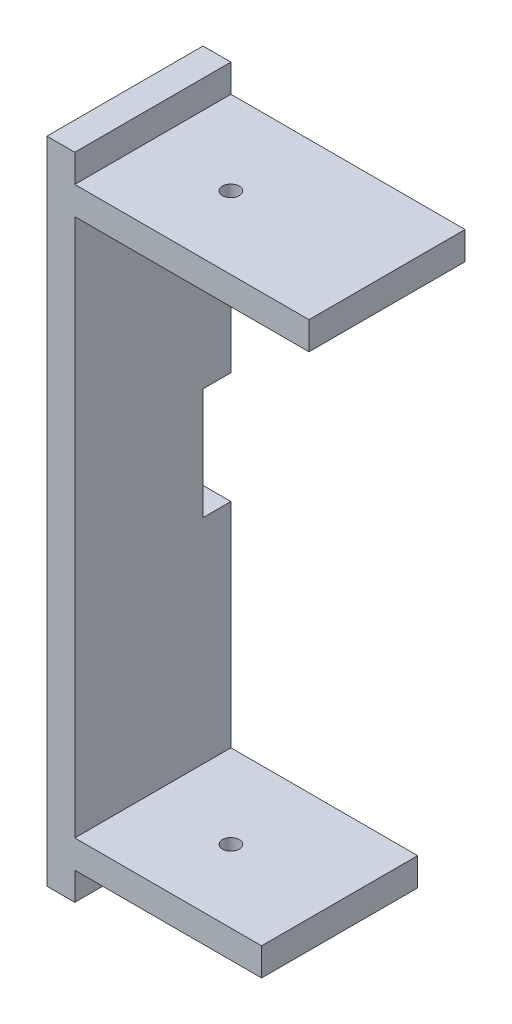
ISO-10303-21;
HEADER;
FILE_DESCRIPTION(('STEP AP214'),'2;1');
FILE_NAME('part.step','',(''),(''),'','','');
FILE_SCHEMA(('AUTOMOTIVE_DESIGN { 1 0 10303 214 1 1 1 1 }'));
ENDSEC;
DATA;
#1=APPLICATION_CONTEXT('core data for automotive mechanical design processes');
#2=APPLICATION_PROTOCOL_DEFINITION('international standard','automotive_design',2000,#1);
#3=PRODUCT_CONTEXT('',#1,'mechanical');
#4=PRODUCT('Part','Part','',(#3));
#5=PRODUCT_RELATED_PRODUCT_CATEGORY('part','',(#4));
#6=PRODUCT_DEFINITION_FORMATION('','',#4);
#7=PRODUCT_DEFINITION_CONTEXT('part definition',#1,'design');
#8=PRODUCT_DEFINITION('design','',#6,#7);
#9=PRODUCT_DEFINITION_SHAPE('','',#8);
#10=(LENGTH_UNIT() NAMED_UNIT(*) SI_UNIT(.MILLI.,.METRE.));
#11=(NAMED_UNIT(*) PLANE_ANGLE_UNIT() SI_UNIT($,.RADIAN.));
#12=(NAMED_UNIT(*) SI_UNIT($,.STERADIAN.) SOLID_ANGLE_UNIT());
#13=UNCERTAINTY_MEASURE_WITH_UNIT(LENGTH_MEASURE(1.E-05),#10,'distance_accuracy_value','');
#14=(GEOMETRIC_REPRESENTATION_CONTEXT(3) GLOBAL_UNCERTAINTY_ASSIGNED_CONTEXT((#13)) GLOBAL_UNIT_ASSIGNED_CONTEXT((#10,
#11,#12)) REPRESENTATION_CONTEXT('',''));
#15=CARTESIAN_POINT('',(0.,0.,0.));
#16=DIRECTION('',(0.,0.,1.));
#17=DIRECTION('',(1.,0.,0.));
#18=AXIS2_PLACEMENT_3D('',#15,#16,#17);
#19=CARTESIAN_POINT('',(0.,0.,0.));
#20=DIRECTION('',(0.,0.,1.));
#21=DIRECTION('',(1.,0.,0.));
#22=AXIS2_PLACEMENT_3D('',#19,#20,#21);
#23=PLANE('',#22);
#24=DIRECTION('',(0.,1.,0.));
#25=VECTOR('',#24,1.);
#26=CARTESIAN_POINT('',(-17.4513640036709,95.3038771767903,0.));
#27=LINE('',#26,#25);
#28=CARTESIAN_POINT('',(-17.4513640036709,57.0538771767903,0.));
#29=VERTEX_POINT('',#28);
#30=CARTESIAN_POINT('',(-17.4513640036709,95.3038771767903,0.));
#31=VERTEX_POINT('',#30);
#32=EDGE_CURVE('E181',#29,#31,#27,.T.);
#33=ORIENTED_EDGE('',*,*,#32,.F.);
#34=DIRECTION('',(1.,0.,0.));
#35=VECTOR('',#34,1.);
#36=CARTESIAN_POINT('',(-17.4513640036709,57.0538771767903,0.));
#37=LINE('',#36,#35);
#38=CARTESIAN_POINT('',(-22.451364003671,57.0538771767903,0.));
#39=VERTEX_POINT('',#38);
#40=EDGE_CURVE('E280',#39,#29,#37,.T.);
#41=ORIENTED_EDGE('',*,*,#40,.F.);
#42=DIRECTION('',(0.,-1.,0.));
#43=VECTOR('',#42,1.);
#44=CARTESIAN_POINT('',(-22.451364003671,105.30387717679,0.));
#45=LINE('',#44,#43);
#46=CARTESIAN_POINT('',(-22.451364003671,105.30387717679,0.));
#47=VERTEX_POINT('',#46);
#48=EDGE_CURVE('E167',#47,#39,#45,.T.);
#49=ORIENTED_EDGE('',*,*,#48,.F.);
#50=DIRECTION('',(-1.,0.,0.));
#51=VECTOR('',#50,1.);
#52=CARTESIAN_POINT('',(-22.451364003671,105.30387717679,0.));
#53=LINE('',#52,#51);
#54=CARTESIAN_POINT('',(-17.451364003671,105.30387717679,0.));
#55=VERTEX_POINT('',#54);
#56=EDGE_CURVE('E103',#55,#47,#53,.T.);
#57=ORIENTED_EDGE('',*,*,#56,.F.);
#58=DIRECTION('',(0.,1.,0.));
#59=VECTOR('',#58,1.);
#60=CARTESIAN_POINT('',(-17.451364003671,105.30387717679,0.));
#61=LINE('',#60,#59);
#62=CARTESIAN_POINT('',(-17.4513640036709,100.30387717679,0.));
#63=VERTEX_POINT('',#62);
#64=EDGE_CURVE('E190',#63,#55,#61,.T.);
#65=ORIENTED_EDGE('',*,*,#64,.F.);
#66=DIRECTION('',(-1.,0.,0.));
#67=VECTOR('',#66,1.);
#68=CARTESIAN_POINT('',(-17.4513640036709,100.30387717679,0.));
#69=LINE('',#68,#67);
#70=CARTESIAN_POINT('',(24.5486359963291,100.30387717679,0.));
#71=VERTEX_POINT('',#70);
#72=EDGE_CURVE('E155',#71,#63,#69,.T.);
#73=ORIENTED_EDGE('',*,*,#72,.F.);
#74=DIRECTION('',(0.,1.,0.));
#75=VECTOR('',#74,1.);
#76=CARTESIAN_POINT('',(24.5486359963291,100.30387717679,0.));
#77=LINE('',#76,#75);
#78=CARTESIAN_POINT('',(24.5486359963291,95.3038771767903,0.));
#79=VERTEX_POINT('',#78);
#80=EDGE_CURVE('E187',#79,#71,#77,.T.);
#81=ORIENTED_EDGE('',*,*,#80,.F.);
#82=DIRECTION('',(1.,0.,0.));
#83=VECTOR('',#82,1.);
#84=CARTESIAN_POINT('',(-17.4513640036709,95.3038771767903,0.));
#85=LINE('',#84,#83);
#86=EDGE_CURVE('E185',#31,#79,#85,.T.);
#87=ORIENTED_EDGE('',*,*,#86,.F.);
#88=EDGE_LOOP('',(#33,#41,#49,#57,#65,#73,#81,#87));
#89=FACE_BOUND('',#88,.T.);
#90=ADVANCED_FACE('F33',(#89),#23,.F.);
#91=CARTESIAN_POINT('',(-22.451364003671,105.30387717679,28.));
#92=DIRECTION('',(1.,0.,0.));
#93=DIRECTION('',(0.,1.,0.));
#94=AXIS2_PLACEMENT_3D('',#91,#92,#93);
#95=PLANE('',#94);
#96=ORIENTED_EDGE('',*,*,#48,.T.);
#97=DIRECTION('',(0.,0.,-1.));
#98=VECTOR('',#97,1.);
#99=CARTESIAN_POINT('',(-22.451364003671,57.0538771767903,5.));
#100=LINE('',#99,#98);
#101=CARTESIAN_POINT('',(-22.451364003671,57.0538771767903,5.));
#102=VERTEX_POINT('',#101);
#103=EDGE_CURVE('E274',#102,#39,#100,.T.);
#104=ORIENTED_EDGE('',*,*,#103,.F.);
#105=DIRECTION('',(0.,1.,0.));
#106=VECTOR('',#105,1.);
#107=CARTESIAN_POINT('',(-22.451364003671,37.0538771767903,5.));
#108=LINE('',#107,#106);
#109=CARTESIAN_POINT('',(-22.451364003671,37.0538771767903,5.));
#110=VERTEX_POINT('',#109);
#111=EDGE_CURVE('E289',#110,#102,#108,.T.);
#112=ORIENTED_EDGE('',*,*,#111,.F.);
#113=DIRECTION('',(0.,0.,-1.));
#114=VECTOR('',#113,1.);
#115=CARTESIAN_POINT('',(-22.451364003671,37.0538771767903,5.));
#116=LINE('',#115,#114);
#117=CARTESIAN_POINT('',(-22.451364003671,37.0538771767903,0.));
#118=VERTEX_POINT('',#117);
#119=EDGE_CURVE('E270',#110,#118,#116,.T.);
#120=ORIENTED_EDGE('',*,*,#119,.T.);
#121=CARTESIAN_POINT('',(-22.4513640036709,-11.1961228232097,0.));
#122=VERTEX_POINT('',#121);
#123=EDGE_CURVE('E171',#118,#122,#45,.T.);
#124=ORIENTED_EDGE('',*,*,#123,.T.);
#125=DIRECTION('',(0.,0.,-1.));
#126=VECTOR('',#125,1.);
#127=CARTESIAN_POINT('',(-22.4513640036709,-11.1961228232097,28.));
#128=LINE('',#127,#126);
#129=CARTESIAN_POINT('',(-22.4513640036709,-11.1961228232097,28.));
#130=VERTEX_POINT('',#129);
#131=EDGE_CURVE('E11',#130,#122,#128,.T.);
#132=ORIENTED_EDGE('',*,*,#131,.F.);
#133=DIRECTION('',(0.,-1.,0.));
#134=VECTOR('',#133,1.);
#135=CARTESIAN_POINT('',(-22.451364003671,105.30387717679,28.));
#136=LINE('',#135,#134);
#137=CARTESIAN_POINT('',(-22.451364003671,105.30387717679,28.));
#138=VERTEX_POINT('',#137);
#139=EDGE_CURVE('E193',#138,#130,#136,.T.);
#140=ORIENTED_EDGE('',*,*,#139,.F.);
#141=DIRECTION('',(0.,0.,-1.));
#142=VECTOR('',#141,1.);
#143=CARTESIAN_POINT('',(-22.451364003671,105.30387717679,28.));
#144=LINE('',#143,#142);
#145=EDGE_CURVE('E163',#138,#47,#144,.T.);
#146=ORIENTED_EDGE('',*,*,#145,.T.);
#147=EDGE_LOOP('',(#96,#104,#112,#120,#124,#132,#140,#146));
#148=FACE_BOUND('',#147,.T.);
#149=ADVANCED_FACE('F35',(#148),#95,.F.);
#150=CARTESIAN_POINT('',(-22.4513640036709,-11.1961228232097,28.));
#151=DIRECTION('',(0.,1.,0.));
#152=DIRECTION('',(0.,0.,1.));
#153=AXIS2_PLACEMENT_3D('',#150,#151,#152);
#154=PLANE('',#153);
#155=DIRECTION('',(1.,0.,0.));
#156=VECTOR('',#155,1.);
#157=CARTESIAN_POINT('',(-22.4513640036709,-11.1961228232097,0.));
#158=LINE('',#157,#156);
#159=CARTESIAN_POINT('',(-17.4513640036709,-11.1961228232097,0.));
#160=VERTEX_POINT('',#159);
#161=EDGE_CURVE('E170',#122,#160,#158,.T.);
#162=ORIENTED_EDGE('',*,*,#161,.T.);
#163=DIRECTION('',(0.,0.,-1.));
#164=VECTOR('',#163,1.);
#165=CARTESIAN_POINT('',(-17.4513640036709,-11.1961228232097,28.));
#166=LINE('',#165,#164);
#167=CARTESIAN_POINT('',(-17.4513640036709,-11.1961228232097,28.));
#168=VERTEX_POINT('',#167);
#169=EDGE_CURVE('E42',#168,#160,#166,.T.);
#170=ORIENTED_EDGE('',*,*,#169,.F.);
#171=DIRECTION('',(1.,0.,0.));
#172=VECTOR('',#171,1.);
#173=CARTESIAN_POINT('',(-22.4513640036709,-11.1961228232097,28.));
#174=LINE('',#173,#172);
#175=EDGE_CURVE('E111',#130,#168,#174,.T.);
#176=ORIENTED_EDGE('',*,*,#175,.F.);
#177=ORIENTED_EDGE('',*,*,#131,.T.);
#178=EDGE_LOOP('',(#162,#170,#176,#177));
#179=FACE_BOUND('',#178,.T.);
#180=ADVANCED_FACE('F334',(#179),#154,.F.);
#181=CARTESIAN_POINT('',(-17.4513640036709,-6.19612282320975,28.));
#182=DIRECTION('',(-1.,0.,0.));
#183=DIRECTION('',(0.,-1.,0.));
#184=AXIS2_PLACEMENT_3D('',#181,#182,#183);
#185=PLANE('',#184);
#186=DIRECTION('',(0.,1.,0.));
#187=VECTOR('',#186,1.);
#188=CARTESIAN_POINT('',(-17.4513640036709,-6.19612282320975,0.));
#189=LINE('',#188,#187);
#190=CARTESIAN_POINT('',(-17.4513640036709,-6.19612282320975,0.));
#191=VERTEX_POINT('',#190);
#192=EDGE_CURVE('E173',#160,#191,#189,.T.);
#193=ORIENTED_EDGE('',*,*,#192,.T.);
#194=DIRECTION('',(0.,0.,-1.));
#195=VECTOR('',#194,1.);
#196=CARTESIAN_POINT('',(-17.4513640036709,-6.19612282320975,28.));
#197=LINE('',#196,#195);
#198=CARTESIAN_POINT('',(-17.4513640036709,-6.19612282320975,28.));
#199=VERTEX_POINT('',#198);
#200=EDGE_CURVE('E212',#199,#191,#197,.T.);
#201=ORIENTED_EDGE('',*,*,#200,.F.);
#202=DIRECTION('',(0.,1.,0.));
#203=VECTOR('',#202,1.);
#204=CARTESIAN_POINT('',(-17.4513640036709,-6.19612282320975,28.));
#205=LINE('',#204,#203);
#206=EDGE_CURVE('E221',#168,#199,#205,.T.);
#207=ORIENTED_EDGE('',*,*,#206,.F.);
#208=ORIENTED_EDGE('',*,*,#169,.T.);
#209=EDGE_LOOP('',(#193,#201,#207,#208));
#210=FACE_BOUND('',#209,.T.);
#211=ADVANCED_FACE('F219',(#210),#185,.F.);
#212=CARTESIAN_POINT('',(-17.4513640036709,-6.19612282320975,28.));
#213=DIRECTION('',(0.,1.,0.));
#214=DIRECTION('',(-1.,0.,0.));
#215=AXIS2_PLACEMENT_3D('',#212,#213,#214);
#216=PLANE('',#215);
#217=CARTESIAN_POINT('',(-2.45136400367091,-6.19612282320975,15.));
#218=DIRECTION('',(0.,-1.,0.));
#219=DIRECTION('',(1.,0.,0.));
#220=AXIS2_PLACEMENT_3D('',#217,#218,#219);
#221=CIRCLE('',#220,1.5);
#222=CARTESIAN_POINT('',(-0.951364003670911,-6.19612282320975,15.));
#223=VERTEX_POINT('',#222);
#224=EDGE_CURVE('E302',#223,#223,#221,.T.);
#225=ORIENTED_EDGE('',*,*,#224,.F.);
#226=EDGE_LOOP('',(#225));
#227=FACE_BOUND('',#226,.T.);
#228=DIRECTION('',(1.,0.,0.));
#229=VECTOR('',#228,1.);
#230=CARTESIAN_POINT('',(-17.4513640036709,-6.19612282320975,0.));
#231=LINE('',#230,#229);
#232=CARTESIAN_POINT('',(16.0486359963291,-6.19612282320975,0.));
#233=VERTEX_POINT('',#232);
#234=EDGE_CURVE('E175',#191,#233,#231,.T.);
#235=ORIENTED_EDGE('',*,*,#234,.T.);
#236=DIRECTION('',(0.,0.,-1.));
#237=VECTOR('',#236,1.);
#238=CARTESIAN_POINT('',(16.0486359963291,-6.19612282320975,28.));
#239=LINE('',#238,#237);
#240=CARTESIAN_POINT('',(16.0486359963291,-6.19612282320975,28.));
#241=VERTEX_POINT('',#240);
#242=EDGE_CURVE('E209',#241,#233,#239,.T.);
#243=ORIENTED_EDGE('',*,*,#242,.F.);
#244=DIRECTION('',(1.,0.,0.));
#245=VECTOR('',#244,1.);
#246=CARTESIAN_POINT('',(-17.4513640036709,-6.19612282320975,28.));
#247=LINE('',#246,#245);
#248=EDGE_CURVE('E240',#199,#241,#247,.T.);
#249=ORIENTED_EDGE('',*,*,#248,.F.);
#250=ORIENTED_EDGE('',*,*,#200,.T.);
#251=EDGE_LOOP('',(#235,#243,#249,#250));
#252=FACE_BOUND('',#251,.T.);
#253=ADVANCED_FACE('F231',(#227,#252),#216,.F.);
#254=CARTESIAN_POINT('',(16.0486359963291,-6.19612282320975,28.));
#255=DIRECTION('',(-1.,0.,0.));
#256=DIRECTION('',(0.,-1.,0.));
#257=AXIS2_PLACEMENT_3D('',#254,#255,#256);
#258=PLANE('',#257);
#259=DIRECTION('',(0.,1.,0.));
#260=VECTOR('',#259,1.);
#261=CARTESIAN_POINT('',(16.0486359963291,-6.19612282320975,0.));
#262=LINE('',#261,#260);
#263=CARTESIAN_POINT('',(16.0486359963291,-1.19612282320975,0.));
#264=VERTEX_POINT('',#263);
#265=EDGE_CURVE('E177',#233,#264,#262,.T.);
#266=ORIENTED_EDGE('',*,*,#265,.T.);
#267=DIRECTION('',(0.,0.,-1.));
#268=VECTOR('',#267,1.);
#269=CARTESIAN_POINT('',(16.0486359963291,-1.19612282320975,28.));
#270=LINE('',#269,#268);
#271=CARTESIAN_POINT('',(16.0486359963291,-1.19612282320975,28.));
#272=VERTEX_POINT('',#271);
#273=EDGE_CURVE('E206',#272,#264,#270,.T.);
#274=ORIENTED_EDGE('',*,*,#273,.F.);
#275=DIRECTION('',(0.,1.,0.));
#276=VECTOR('',#275,1.);
#277=CARTESIAN_POINT('',(16.0486359963291,-6.19612282320975,28.));
#278=LINE('',#277,#276);
#279=EDGE_CURVE('E237',#241,#272,#278,.T.);
#280=ORIENTED_EDGE('',*,*,#279,.F.);
#281=ORIENTED_EDGE('',*,*,#242,.T.);
#282=EDGE_LOOP('',(#266,#274,#280,#281));
#283=FACE_BOUND('',#282,.T.);
#284=ADVANCED_FACE('F235',(#283),#258,.F.);
#285=CARTESIAN_POINT('',(-17.4513640036709,-1.19612282320975,28.));
#286=DIRECTION('',(0.,-1.,0.));
#287=DIRECTION('',(0.,0.,-1.));
#288=AXIS2_PLACEMENT_3D('',#285,#286,#287);
#289=PLANE('',#288);
#290=CARTESIAN_POINT('',(-2.45136400367091,-1.19612282320974,15.));
#291=DIRECTION('',(0.,-1.,0.));
#292=DIRECTION('',(0.,0.,-1.));
#293=AXIS2_PLACEMENT_3D('',#290,#291,#292);
#294=CIRCLE('',#293,1.5);
#295=CARTESIAN_POINT('',(-2.45136400367091,-1.19612282320974,13.5));
#296=VERTEX_POINT('',#295);
#297=EDGE_CURVE('E286',#296,#296,#294,.T.);
#298=ORIENTED_EDGE('',*,*,#297,.T.);
#299=EDGE_LOOP('',(#298));
#300=FACE_BOUND('',#299,.T.);
#301=DIRECTION('',(-1.,0.,0.));
#302=VECTOR('',#301,1.);
#303=CARTESIAN_POINT('',(-17.4513640036709,-1.19612282320975,0.));
#304=LINE('',#303,#302);
#305=CARTESIAN_POINT('',(-17.4513640036709,-1.19612282320975,0.));
#306=VERTEX_POINT('',#305);
#307=EDGE_CURVE('E179',#264,#306,#304,.T.);
#308=ORIENTED_EDGE('',*,*,#307,.T.);
#309=DIRECTION('',(0.,0.,-1.));
#310=VECTOR('',#309,1.);
#311=CARTESIAN_POINT('',(-17.4513640036709,-1.19612282320975,28.));
#312=LINE('',#311,#310);
#313=CARTESIAN_POINT('',(-17.4513640036709,-1.19612282320975,28.));
#314=VERTEX_POINT('',#313);
#315=EDGE_CURVE('E203',#314,#306,#312,.T.);
#316=ORIENTED_EDGE('',*,*,#315,.F.);
#317=DIRECTION('',(-1.,0.,0.));
#318=VECTOR('',#317,1.);
#319=CARTESIAN_POINT('',(-17.4513640036709,-1.19612282320975,28.));
#320=LINE('',#319,#318);
#321=EDGE_CURVE('E239',#272,#314,#320,.T.);
#322=ORIENTED_EDGE('',*,*,#321,.F.);
#323=ORIENTED_EDGE('',*,*,#273,.T.);
#324=EDGE_LOOP('',(#308,#316,#322,#323));
#325=FACE_BOUND('',#324,.T.);
#326=ADVANCED_FACE('F326',(#300,#325),#289,.F.);
#327=CARTESIAN_POINT('',(-17.4513640036709,95.3038771767903,28.));
#328=DIRECTION('',(-1.,0.,0.));
#329=DIRECTION('',(0.,-1.,0.));
#330=AXIS2_PLACEMENT_3D('',#327,#328,#329);
#331=PLANE('',#330);
#332=DIRECTION('',(0.,-1.,0.));
#333=VECTOR('',#332,1.);
#334=CARTESIAN_POINT('',(-17.4513640036709,37.0538771767903,5.));
#335=LINE('',#334,#333);
#336=CARTESIAN_POINT('',(-17.4513640036709,57.0538771767903,5.));
#337=VERTEX_POINT('',#336);
#338=CARTESIAN_POINT('',(-17.4513640036709,37.0538771767903,5.));
#339=VERTEX_POINT('',#338);
#340=EDGE_CURVE('E283',#337,#339,#335,.T.);
#341=ORIENTED_EDGE('',*,*,#340,.F.);
#342=DIRECTION('',(0.,0.,-1.));
#343=VECTOR('',#342,1.);
#344=CARTESIAN_POINT('',(-17.4513640036709,57.0538771767903,5.));
#345=LINE('',#344,#343);
#346=EDGE_CURVE('E277',#337,#29,#345,.T.);
#347=ORIENTED_EDGE('',*,*,#346,.T.);
#348=ORIENTED_EDGE('',*,*,#32,.T.);
#349=DIRECTION('',(0.,0.,-1.));
#350=VECTOR('',#349,1.);
#351=CARTESIAN_POINT('',(-17.4513640036709,95.3038771767903,28.));
#352=LINE('',#351,#350);
#353=CARTESIAN_POINT('',(-17.4513640036709,95.3038771767903,28.));
#354=VERTEX_POINT('',#353);
#355=EDGE_CURVE('E200',#354,#31,#352,.T.);
#356=ORIENTED_EDGE('',*,*,#355,.F.);
#357=DIRECTION('',(0.,1.,0.));
#358=VECTOR('',#357,1.);
#359=CARTESIAN_POINT('',(-17.4513640036709,95.3038771767903,28.));
#360=LINE('',#359,#358);
#361=EDGE_CURVE('E242',#314,#354,#360,.T.);
#362=ORIENTED_EDGE('',*,*,#361,.F.);
#363=ORIENTED_EDGE('',*,*,#315,.T.);
#364=CARTESIAN_POINT('',(-17.4513640036709,37.0538771767903,0.));
#365=VERTEX_POINT('',#364);
#366=EDGE_CURVE('E182',#306,#365,#27,.T.);
#367=ORIENTED_EDGE('',*,*,#366,.T.);
#368=DIRECTION('',(0.,0.,-1.));
#369=VECTOR('',#368,1.);
#370=CARTESIAN_POINT('',(-17.4513640036709,37.0538771767903,5.));
#371=LINE('',#370,#369);
#372=EDGE_CURVE('E49',#339,#365,#371,.T.);
#373=ORIENTED_EDGE('',*,*,#372,.F.);
#374=EDGE_LOOP('',(#341,#347,#348,#356,#362,#363,#367,#373));
#375=FACE_BOUND('',#374,.T.);
#376=ADVANCED_FACE('F319',(#375),#331,.F.);
#377=CARTESIAN_POINT('',(-17.4513640036709,95.3038771767903,28.));
#378=DIRECTION('',(0.,1.,0.));
#379=DIRECTION('',(0.,0.,1.));
#380=AXIS2_PLACEMENT_3D('',#377,#378,#379);
#381=PLANE('',#380);
#382=CARTESIAN_POINT('',(-2.4513640036709,95.3038771767903,15.));
#383=DIRECTION('',(0.,1.,0.));
#384=DIRECTION('',(0.,0.,1.));
#385=AXIS2_PLACEMENT_3D('',#382,#383,#384);
#386=CIRCLE('',#385,1.5);
#387=CARTESIAN_POINT('',(-2.4513640036709,95.3038771767903,16.5));
#388=VERTEX_POINT('',#387);
#389=EDGE_CURVE('E299',#388,#388,#386,.T.);
#390=ORIENTED_EDGE('',*,*,#389,.T.);
#391=EDGE_LOOP('',(#390));
#392=FACE_BOUND('',#391,.T.);
#393=ORIENTED_EDGE('',*,*,#86,.T.);
#394=DIRECTION('',(0.,0.,-1.));
#395=VECTOR('',#394,1.);
#396=CARTESIAN_POINT('',(24.5486359963291,95.3038771767903,28.));
#397=LINE('',#396,#395);
#398=CARTESIAN_POINT('',(24.5486359963291,95.3038771767903,28.));
#399=VERTEX_POINT('',#398);
#400=EDGE_CURVE('E197',#399,#79,#397,.T.);
#401=ORIENTED_EDGE('',*,*,#400,.F.);
#402=DIRECTION('',(1.,0.,0.));
#403=VECTOR('',#402,1.);
#404=CARTESIAN_POINT('',(-17.4513640036709,95.3038771767903,28.));
#405=LINE('',#404,#403);
#406=EDGE_CURVE('E248',#354,#399,#405,.T.);
#407=ORIENTED_EDGE('',*,*,#406,.F.);
#408=ORIENTED_EDGE('',*,*,#355,.T.);
#409=EDGE_LOOP('',(#393,#401,#407,#408));
#410=FACE_BOUND('',#409,.T.);
#411=ADVANCED_FACE('F254',(#392,#410),#381,.F.);
#412=CARTESIAN_POINT('',(24.5486359963291,100.30387717679,28.));
#413=DIRECTION('',(-1.,0.,0.));
#414=DIRECTION('',(0.,-1.,0.));
#415=AXIS2_PLACEMENT_3D('',#412,#413,#414);
#416=PLANE('',#415);
#417=ORIENTED_EDGE('',*,*,#80,.T.);
#418=DIRECTION('',(0.,0.,-1.));
#419=VECTOR('',#418,1.);
#420=CARTESIAN_POINT('',(24.5486359963291,100.30387717679,28.));
#421=LINE('',#420,#419);
#422=CARTESIAN_POINT('',(24.5486359963291,100.30387717679,28.));
#423=VERTEX_POINT('',#422);
#424=EDGE_CURVE('E158',#423,#71,#421,.T.);
#425=ORIENTED_EDGE('',*,*,#424,.F.);
#426=DIRECTION('',(0.,1.,0.));
#427=VECTOR('',#426,1.);
#428=CARTESIAN_POINT('',(24.5486359963291,100.30387717679,28.));
#429=LINE('',#428,#427);
#430=EDGE_CURVE('E146',#399,#423,#429,.T.);
#431=ORIENTED_EDGE('',*,*,#430,.F.);
#432=ORIENTED_EDGE('',*,*,#400,.T.);
#433=EDGE_LOOP('',(#417,#425,#431,#432));
#434=FACE_BOUND('',#433,.T.);
#435=ADVANCED_FACE('F258',(#434),#416,.F.);
#436=CARTESIAN_POINT('',(-17.4513640036709,100.30387717679,28.));
#437=DIRECTION('',(0.,-1.,0.));
#438=DIRECTION('',(0.,0.,-1.));
#439=AXIS2_PLACEMENT_3D('',#436,#437,#438);
#440=PLANE('',#439);
#441=CARTESIAN_POINT('',(-2.4513640036709,100.30387717679,15.));
#442=DIRECTION('',(0.,-1.,0.));
#443=DIRECTION('',(0.,0.,-1.));
#444=AXIS2_PLACEMENT_3D('',#441,#442,#443);
#445=CIRCLE('',#444,1.5);
#446=CARTESIAN_POINT('',(-2.4513640036709,100.30387717679,13.5));
#447=VERTEX_POINT('',#446);
#448=EDGE_CURVE('E37',#447,#447,#445,.T.);
#449=ORIENTED_EDGE('',*,*,#448,.T.);
#450=EDGE_LOOP('',(#449));
#451=FACE_BOUND('',#450,.T.);
#452=ORIENTED_EDGE('',*,*,#72,.T.);
#453=DIRECTION('',(0.,0.,-1.));
#454=VECTOR('',#453,1.);
#455=CARTESIAN_POINT('',(-17.4513640036709,100.30387717679,28.));
#456=LINE('',#455,#454);
#457=CARTESIAN_POINT('',(-17.4513640036709,100.30387717679,28.));
#458=VERTEX_POINT('',#457);
#459=EDGE_CURVE('E152',#458,#63,#456,.T.);
#460=ORIENTED_EDGE('',*,*,#459,.F.);
#461=DIRECTION('',(-1.,0.,0.));
#462=VECTOR('',#461,1.);
#463=CARTESIAN_POINT('',(-17.4513640036709,100.30387717679,28.));
#464=LINE('',#463,#462);
#465=EDGE_CURVE('E139',#423,#458,#464,.T.);
#466=ORIENTED_EDGE('',*,*,#465,.F.);
#467=ORIENTED_EDGE('',*,*,#424,.T.);
#468=EDGE_LOOP('',(#452,#460,#466,#467));
#469=FACE_BOUND('',#468,.T.);
#470=ADVANCED_FACE('F153',(#451,#469),#440,.F.);
#471=CARTESIAN_POINT('',(-17.451364003671,105.30387717679,28.));
#472=DIRECTION('',(-1.,0.,0.));
#473=DIRECTION('',(0.,-1.,0.));
#474=AXIS2_PLACEMENT_3D('',#471,#472,#473);
#475=PLANE('',#474);
#476=ORIENTED_EDGE('',*,*,#64,.T.);
#477=DIRECTION('',(0.,0.,-1.));
#478=VECTOR('',#477,1.);
#479=CARTESIAN_POINT('',(-17.451364003671,105.30387717679,28.));
#480=LINE('',#479,#478);
#481=CARTESIAN_POINT('',(-17.451364003671,105.30387717679,28.));
#482=VERTEX_POINT('',#481);
#483=EDGE_CURVE('E159',#482,#55,#480,.T.);
#484=ORIENTED_EDGE('',*,*,#483,.F.);
#485=DIRECTION('',(0.,1.,0.));
#486=VECTOR('',#485,1.);
#487=CARTESIAN_POINT('',(-17.451364003671,105.30387717679,28.));
#488=LINE('',#487,#486);
#489=EDGE_CURVE('E143',#458,#482,#488,.T.);
#490=ORIENTED_EDGE('',*,*,#489,.F.);
#491=ORIENTED_EDGE('',*,*,#459,.T.);
#492=EDGE_LOOP('',(#476,#484,#490,#491));
#493=FACE_BOUND('',#492,.T.);
#494=ADVANCED_FACE('F161',(#493),#475,.F.);
#495=CARTESIAN_POINT('',(-22.451364003671,105.30387717679,28.));
#496=DIRECTION('',(0.,-1.,0.));
#497=DIRECTION('',(0.,0.,-1.));
#498=AXIS2_PLACEMENT_3D('',#495,#496,#497);
#499=PLANE('',#498);
#500=ORIENTED_EDGE('',*,*,#56,.T.);
#501=ORIENTED_EDGE('',*,*,#145,.F.);
#502=DIRECTION('',(-1.,0.,0.));
#503=VECTOR('',#502,1.);
#504=CARTESIAN_POINT('',(-22.451364003671,105.30387717679,28.));
#505=LINE('',#504,#503);
#506=EDGE_CURVE('E58',#482,#138,#505,.T.);
#507=ORIENTED_EDGE('',*,*,#506,.F.);
#508=ORIENTED_EDGE('',*,*,#483,.T.);
#509=EDGE_LOOP('',(#500,#501,#507,#508));
#510=FACE_BOUND('',#509,.T.);
#511=ADVANCED_FACE('F262',(#510),#499,.F.);
#512=CARTESIAN_POINT('',(0.,0.,28.));
#513=DIRECTION('',(0.,0.,1.));
#514=DIRECTION('',(1.,0.,0.));
#515=AXIS2_PLACEMENT_3D('',#512,#513,#514);
#516=PLANE('',#515);
#517=ORIENTED_EDGE('',*,*,#139,.T.);
#518=ORIENTED_EDGE('',*,*,#175,.T.);
#519=ORIENTED_EDGE('',*,*,#206,.T.);
#520=ORIENTED_EDGE('',*,*,#248,.T.);
#521=ORIENTED_EDGE('',*,*,#279,.T.);
#522=ORIENTED_EDGE('',*,*,#321,.T.);
#523=ORIENTED_EDGE('',*,*,#361,.T.);
#524=ORIENTED_EDGE('',*,*,#406,.T.);
#525=ORIENTED_EDGE('',*,*,#430,.T.);
#526=ORIENTED_EDGE('',*,*,#465,.T.);
#527=ORIENTED_EDGE('',*,*,#489,.T.);
#528=ORIENTED_EDGE('',*,*,#506,.T.);
#529=EDGE_LOOP('',(#517,#518,#519,#520,#521,#522,#523,#524,#525,#526,#527,#528));
#530=FACE_BOUND('',#529,.T.);
#531=ADVANCED_FACE('F141',(#530),#516,.T.);
#532=ORIENTED_EDGE('',*,*,#123,.F.);
#533=DIRECTION('',(-1.,0.,0.));
#534=VECTOR('',#533,1.);
#535=CARTESIAN_POINT('',(-17.4513640036709,37.0538771767903,0.));
#536=LINE('',#535,#534);
#537=EDGE_CURVE('E284',#365,#118,#536,.T.);
#538=ORIENTED_EDGE('',*,*,#537,.F.);
#539=ORIENTED_EDGE('',*,*,#366,.F.);
#540=ORIENTED_EDGE('',*,*,#307,.F.);
#541=ORIENTED_EDGE('',*,*,#265,.F.);
#542=ORIENTED_EDGE('',*,*,#234,.F.);
#543=ORIENTED_EDGE('',*,*,#192,.F.);
#544=ORIENTED_EDGE('',*,*,#161,.F.);
#545=EDGE_LOOP('',(#532,#538,#539,#540,#541,#542,#543,#544));
#546=FACE_BOUND('',#545,.T.);
#547=ADVANCED_FACE('F226',(#546),#23,.F.);
#548=CARTESIAN_POINT('',(-17.4513640036709,57.0538771767903,5.));
#549=DIRECTION('',(0.,1.,0.));
#550=DIRECTION('',(0.,0.,1.));
#551=AXIS2_PLACEMENT_3D('',#548,#549,#550);
#552=PLANE('',#551);
#553=ORIENTED_EDGE('',*,*,#40,.T.);
#554=ORIENTED_EDGE('',*,*,#346,.F.);
#555=DIRECTION('',(1.,0.,0.));
#556=VECTOR('',#555,1.);
#557=CARTESIAN_POINT('',(-17.4513640036709,57.0538771767903,5.));
#558=LINE('',#557,#556);
#559=EDGE_CURVE('E271',#102,#337,#558,.T.);
#560=ORIENTED_EDGE('',*,*,#559,.F.);
#561=ORIENTED_EDGE('',*,*,#103,.T.);
#562=EDGE_LOOP('',(#553,#554,#560,#561));
#563=FACE_BOUND('',#562,.T.);
#564=ADVANCED_FACE('F338',(#563),#552,.F.);
#565=CARTESIAN_POINT('',(-17.4513640036709,37.0538771767903,5.));
#566=DIRECTION('',(0.,-1.,0.));
#567=DIRECTION('',(0.,0.,-1.));
#568=AXIS2_PLACEMENT_3D('',#565,#566,#567);
#569=PLANE('',#568);
#570=ORIENTED_EDGE('',*,*,#537,.T.);
#571=ORIENTED_EDGE('',*,*,#119,.F.);
#572=DIRECTION('',(-1.,0.,0.));
#573=VECTOR('',#572,1.);
#574=CARTESIAN_POINT('',(-17.4513640036709,37.0538771767903,5.));
#575=LINE('',#574,#573);
#576=EDGE_CURVE('E292',#339,#110,#575,.T.);
#577=ORIENTED_EDGE('',*,*,#576,.F.);
#578=ORIENTED_EDGE('',*,*,#372,.T.);
#579=EDGE_LOOP('',(#570,#571,#577,#578));
#580=FACE_BOUND('',#579,.T.);
#581=ADVANCED_FACE('F343',(#580),#569,.F.);
#582=CARTESIAN_POINT('',(0.,0.,5.));
#583=DIRECTION('',(0.,0.,1.));
#584=DIRECTION('',(1.,0.,0.));
#585=AXIS2_PLACEMENT_3D('',#582,#583,#584);
#586=PLANE('',#585);
#587=ORIENTED_EDGE('',*,*,#340,.T.);
#588=ORIENTED_EDGE('',*,*,#576,.T.);
#589=ORIENTED_EDGE('',*,*,#111,.T.);
#590=ORIENTED_EDGE('',*,*,#559,.T.);
#591=EDGE_LOOP('',(#587,#588,#589,#590));
#592=FACE_BOUND('',#591,.T.);
#593=ADVANCED_FACE('F314',(#592),#586,.F.);
#594=CARTESIAN_POINT('',(-2.4513640036709,105.30387717679,15.));
#595=DIRECTION('',(0.,-1.,0.));
#596=DIRECTION('',(1.,0.,0.));
#597=AXIS2_PLACEMENT_3D('',#594,#595,#596);
#598=CYLINDRICAL_SURFACE('',#597,1.5);
#599=ORIENTED_EDGE('',*,*,#448,.F.);
#600=EDGE_LOOP('',(#599));
#601=FACE_BOUND('',#600,.T.);
#602=ORIENTED_EDGE('',*,*,#389,.F.);
#603=EDGE_LOOP('',(#602));
#604=FACE_BOUND('',#603,.T.);
#605=ADVANCED_FACE('F310',(#601,#604),#598,.F.);
#606=ORIENTED_EDGE('',*,*,#224,.T.);
#607=EDGE_LOOP('',(#606));
#608=FACE_BOUND('',#607,.T.);
#609=ORIENTED_EDGE('',*,*,#297,.F.);
#610=EDGE_LOOP('',(#609));
#611=FACE_BOUND('',#610,.T.);
#612=ADVANCED_FACE('F313',(#608,#611),#598,.F.);
#613=CLOSED_SHELL('',(#90,#149,#180,#211,#253,#284,#326,#376,#411,#435,#470,#494,#511,#531,#547,
#564,#581,#593,#605,#612));
#614=MANIFOLD_SOLID_BREP('B2',#613);
#615=ADVANCED_BREP_SHAPE_REPRESENTATION('',(#18,#614),#14);
#616=SHAPE_DEFINITION_REPRESENTATION(#9,#615);
ENDSEC;
END-ISO-10303-21;
